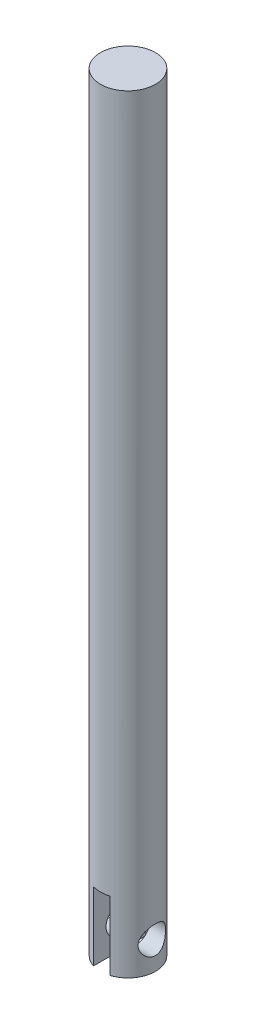
ISO-10303-21;
HEADER;
FILE_DESCRIPTION(('STEP AP214'),'2;1');
FILE_NAME('part.step','',(''),(''),'','','');
FILE_SCHEMA(('AUTOMOTIVE_DESIGN { 1 0 10303 214 1 1 1 1 }'));
ENDSEC;
DATA;
#1=APPLICATION_CONTEXT('core data for automotive mechanical design processes');
#2=APPLICATION_PROTOCOL_DEFINITION('international standard','automotive_design',2000,#1);
#3=PRODUCT_CONTEXT('',#1,'mechanical');
#4=PRODUCT('Part','Part','',(#3));
#5=PRODUCT_RELATED_PRODUCT_CATEGORY('part','',(#4));
#6=PRODUCT_DEFINITION_FORMATION('','',#4);
#7=PRODUCT_DEFINITION_CONTEXT('part definition',#1,'design');
#8=PRODUCT_DEFINITION('design','',#6,#7);
#9=PRODUCT_DEFINITION_SHAPE('','',#8);
#10=(LENGTH_UNIT() NAMED_UNIT(*) SI_UNIT(.MILLI.,.METRE.));
#11=(NAMED_UNIT(*) PLANE_ANGLE_UNIT() SI_UNIT($,.RADIAN.));
#12=(NAMED_UNIT(*) SI_UNIT($,.STERADIAN.) SOLID_ANGLE_UNIT());
#13=UNCERTAINTY_MEASURE_WITH_UNIT(LENGTH_MEASURE(1.E-05),#10,'distance_accuracy_value','');
#14=(GEOMETRIC_REPRESENTATION_CONTEXT(3) GLOBAL_UNCERTAINTY_ASSIGNED_CONTEXT((#13)) GLOBAL_UNIT_ASSIGNED_CONTEXT((#10,
#11,#12)) REPRESENTATION_CONTEXT('',''));
#15=CARTESIAN_POINT('',(0.,0.,0.));
#16=DIRECTION('',(0.,0.,1.));
#17=DIRECTION('',(1.,0.,0.));
#18=AXIS2_PLACEMENT_3D('',#15,#16,#17);
#19=CARTESIAN_POINT('',(0.,0.,0.));
#20=DIRECTION('',(0.,1.,0.));
#21=DIRECTION('',(0.,0.,1.));
#22=AXIS2_PLACEMENT_3D('',#19,#20,#21);
#23=PLANE('',#22);
#24=CARTESIAN_POINT('',(0.,0.,0.));
#25=DIRECTION('',(0.,1.,0.));
#26=DIRECTION('',(0.,0.,1.));
#27=AXIS2_PLACEMENT_3D('',#24,#25,#26);
#28=CIRCLE('',#27,2.);
#29=CARTESIAN_POINT('',(-0.6,0.,-1.90787840283389));
#30=VERTEX_POINT('',#29);
#31=CARTESIAN_POINT('',(-0.6,0.,1.90787840283389));
#32=VERTEX_POINT('',#31);
#33=EDGE_CURVE('E115',#30,#32,#28,.T.);
#34=ORIENTED_EDGE('',*,*,#33,.F.);
#35=DIRECTION('',(0.,0.,1.));
#36=VECTOR('',#35,1.);
#37=CARTESIAN_POINT('',(-0.6,0.,0.));
#38=LINE('',#37,#36);
#39=EDGE_CURVE('E125',#30,#32,#38,.T.);
#40=ORIENTED_EDGE('',*,*,#39,.T.);
#41=EDGE_LOOP('',(#34,#40));
#42=FACE_BOUND('',#41,.T.);
#43=ADVANCED_FACE('F40',(#42),#23,.F.);
#44=CARTESIAN_POINT('',(0.,55.9,0.));
#45=DIRECTION('',(0.,-1.,0.));
#46=DIRECTION('',(0.,0.,-1.));
#47=AXIS2_PLACEMENT_3D('',#44,#45,#46);
#48=CYLINDRICAL_SURFACE('',#47,2.);
#49=CARTESIAN_POINT('',(-2.,1.,0.));
#50=CARTESIAN_POINT('',(-1.99999713404151,1.0000033023195,-0.0525719629529865));
#51=CARTESIAN_POINT('',(-1.99790491019518,1.00417007312167,-0.105206599698033));
#52=CARTESIAN_POINT('',(-1.98974156037396,1.02065288034092,-0.208920235268425));
#53=CARTESIAN_POINT('',(-1.98366287828984,1.03298439299765,-0.259996086713504));
#54=CARTESIAN_POINT('',(-1.96816279403312,1.06519380861679,-0.358933544880574));
#55=CARTESIAN_POINT('',(-1.9587543917752,1.08504238424801,-0.40680680293918));
#56=CARTESIAN_POINT('',(-1.93745776515779,1.13157062136494,-0.498472616806565));
#57=CARTESIAN_POINT('',(-1.9255697363353,1.15824974424885,-0.54226549399005));
#58=CARTESIAN_POINT('',(-1.89956258258057,1.2195172494853,-0.627507817761919));
#59=CARTESIAN_POINT('',(-1.88535199127536,1.25448647923964,-0.668655211122112));
#60=CARTESIAN_POINT('',(-1.85659970246744,1.33052147924703,-0.744779444866977));
#61=CARTESIAN_POINT('',(-1.84205776209035,1.37159185177244,-0.779751583106767));
#62=CARTESIAN_POINT('',(-1.81298951197347,1.46248334952338,-0.845252000450279));
#63=CARTESIAN_POINT('',(-1.79855186970132,1.51273609834591,-0.875225335551637));
#64=CARTESIAN_POINT('',(-1.77285978772321,1.61836733598621,-0.926168226890695));
#65=CARTESIAN_POINT('',(-1.7616030760699,1.67374212872275,-0.947144214966334));
#66=CARTESIAN_POINT('',(-1.74457867037809,1.78466510542192,-0.978132442188588));
#67=CARTESIAN_POINT('',(-1.73852271583714,1.84000445206739,-0.988725857080441));
#68=CARTESIAN_POINT('',(-1.73181889948528,1.95197883777948,-1.00042699330885));
#69=CARTESIAN_POINT('',(-1.73116569343288,2.00861254087116,-1.00154408837307));
#70=CARTESIAN_POINT('',(-1.73510930257248,2.11428602431537,-0.994687287172294));
#71=CARTESIAN_POINT('',(-1.73908763662014,2.16342403122305,-0.987784559536821));
#72=CARTESIAN_POINT('',(-1.7507622873385,2.25972190937304,-0.966939849056932));
#73=CARTESIAN_POINT('',(-1.75845978831776,2.30688114530532,-0.952995623897652));
#74=CARTESIAN_POINT('',(-1.77687476412741,2.39922913256566,-0.918209780386004));
#75=CARTESIAN_POINT('',(-1.78765840663999,2.44434639878579,-0.897215067115995));
#76=CARTESIAN_POINT('',(-1.81103404281404,2.53063429259001,-0.849041687668002));
#77=CARTESIAN_POINT('',(-1.82362684780191,2.57180313560009,-0.821860243812467));
#78=CARTESIAN_POINT('',(-1.85113157903286,2.65452125274323,-0.758066054912788));
#79=CARTESIAN_POINT('',(-1.86613510236746,2.69545687357616,-0.720694458369282));
#80=CARTESIAN_POINT('',(-1.89547623300407,2.7707354185909,-0.639555578741373));
#81=CARTESIAN_POINT('',(-1.90981351958801,2.80507519203388,-0.595785256574285));
#82=CARTESIAN_POINT('',(-1.93701987282964,2.86768566102973,-0.500516505831848));
#83=CARTESIAN_POINT('',(-1.94978984162007,2.89560047244574,-0.448753591599409));
#84=CARTESIAN_POINT('',(-1.97157881121242,2.94209702904301,-0.340466215488797));
#85=CARTESIAN_POINT('',(-1.98060078943553,2.96068618501517,-0.283945576265277));
#86=CARTESIAN_POINT('',(-1.99324333741436,2.98647540371668,-0.172766491660702));
#87=CARTESIAN_POINT('',(-1.99724938301312,2.99449123574678,-0.118341530548324));
#88=CARTESIAN_POINT('',(-2.00073013459102,3.00146473113449,-0.00877959994935366));
#89=CARTESIAN_POINT('',(-2.00020698721312,3.00042668563948,0.0463570198699013));
#90=CARTESIAN_POINT('',(-1.99491192253441,2.98979331158125,0.151232971985993));
#91=CARTESIAN_POINT('',(-1.9904724568819,2.98086746726997,0.201059408049954));
#92=CARTESIAN_POINT('',(-1.97822171314819,2.95576192810492,0.298406892301917));
#93=CARTESIAN_POINT('',(-1.97041006334332,2.93958143354664,0.345927685690997));
#94=CARTESIAN_POINT('',(-1.95184251413669,2.90000153356683,0.438888608449665));
#95=CARTESIAN_POINT('',(-1.94100881769939,2.87640894988319,0.484230397006153));
#96=CARTESIAN_POINT('',(-1.91743974317109,2.82289246435396,0.570461361698921));
#97=CARTESIAN_POINT('',(-1.90470355565785,2.79296586540657,0.611348629775282));
#98=CARTESIAN_POINT('',(-1.87708221337464,2.72423957466713,0.691767689290653));
#99=CARTESIAN_POINT('',(-1.86210884848441,2.68485713154643,0.730772077824639));
#100=CARTESIAN_POINT('',(-1.83262391603874,2.6000748487307,0.80185632111324));
#101=CARTESIAN_POINT('',(-1.81811267381526,2.55467088118363,0.833931385690841));
#102=CARTESIAN_POINT('',(-1.79051192226068,2.45635634579969,0.891707914497696));
#103=CARTESIAN_POINT('',(-1.77752529663472,2.40318873379141,0.917025495878637));
#104=CARTESIAN_POINT('',(-1.75574072368126,2.29248993230748,0.958082826013803));
#105=CARTESIAN_POINT('',(-1.74693738240618,2.23496447349881,0.97383491588757));
#106=CARTESIAN_POINT('',(-1.73561501008667,2.12308977713855,0.993861687449679));
#107=CARTESIAN_POINT('',(-1.73257383460491,2.06896574657096,0.999092996400865));
#108=CARTESIAN_POINT('',(-1.73165354646175,1.96055293282927,1.00068915438079));
#109=CARTESIAN_POINT('',(-1.73377219627553,1.90626423126057,0.997057846624399));
#110=CARTESIAN_POINT('',(-1.74237862050025,1.80451649846799,0.981926125592263));
#111=CARTESIAN_POINT('',(-1.74843094482394,1.7568995298556,0.9712083143428));
#112=CARTESIAN_POINT('',(-1.76371016187918,1.66419188057529,0.943175358224645));
#113=CARTESIAN_POINT('',(-1.77293807569676,1.61910201790803,0.92585809115981));
#114=CARTESIAN_POINT('',(-1.79428530364528,1.52937514901339,0.883815745300683));
#115=CARTESIAN_POINT('',(-1.80655722396191,1.4849720981703,0.858671137816458));
#116=CARTESIAN_POINT('',(-1.8323533163459,1.40072546381941,0.802150971636635));
#117=CARTESIAN_POINT('',(-1.84587813794522,1.36088426948151,0.770772171238649));
#118=CARTESIAN_POINT('',(-1.87462323159313,1.28185801764238,0.698203326664642));
#119=CARTESIAN_POINT('',(-1.88984983311469,1.24334089763808,0.656284423010172));
#120=CARTESIAN_POINT('',(-1.91877752255088,1.17373701657637,0.56615480622028));
#121=CARTESIAN_POINT('',(-1.9324777860804,1.14265426057371,0.517940723256785));
#122=CARTESIAN_POINT('',(-1.95698009585103,1.0887636372378,0.415931596819947));
#123=CARTESIAN_POINT('',(-1.96776096562909,1.06601583058857,0.362099503934614));
#124=CARTESIAN_POINT('',(-1.98501341363465,1.03019183208105,0.250742101294191));
#125=CARTESIAN_POINT('',(-1.99149723372932,1.01708815317042,0.193227799623166));
#126=CARTESIAN_POINT('',(-1.99695461909663,1.00610258892415,0.112601946483384));
#127=CARTESIAN_POINT('',(-1.99809365339202,1.00381735913638,0.0901618794394989));
#128=CARTESIAN_POINT('',(-1.99961696977865,1.00076533448319,0.0451517318071578));
#129=CARTESIAN_POINT('',(-2.00000123103763,0.9999985815288,0.0225816476473815));
#130=CARTESIAN_POINT('',(-2.,1.,0.));
#131=B_SPLINE_CURVE_WITH_KNOTS('',3,(#49,#50,#51,#52,#53,#54,#55,#56,#57,#58,#59,#60,#61,#62,
#63,#64,#65,#66,#67,#68,#69,#70,#71,#72,#73,#74,#75,#76,#77,#78,#79,#80,#81,#82,#83,#84,#85,#86,
#87,#88,#89,#90,#91,#92,#93,#94,#95,#96,#97,#98,#99,#100,#101,#102,#103,#104,#105,#106,#107,
#108,#109,#110,#111,#112,#113,#114,#115,#116,#117,#118,#119,#120,#121,#122,#123,#124,#125,#126,
#127,#128,#129,#130),.UNSPECIFIED.,.T.,.F.,(4,2,2,2,2,2,2,2,2,2,2,2,2,2,2,2,2,2,2,2,2,2,2,2,2,2,
2,2,2,2,2,2,2,2,2,2,2,2,2,2,4),(0.,0.157624257420292,0.315548149709198,0.472862155492298,
0.630163760581568,0.796981758718089,0.963926237654036,1.14381726430753,1.32357947898281,
1.4925801214023,1.6614135732902,1.81005712409321,1.95874803925678,2.11090240168487,
2.26312521260222,2.43464941333878,2.60625534598686,2.78583022214441,2.9652621691228,
3.12983290471346,3.29432564511476,3.44606906506122,3.59782921630931,3.75392856027899,
3.91009450748339,4.08159610644419,4.25321588615432,4.43314682159674,4.61284511940778,
4.77529307498373,4.93767059860005,5.08457930244183,5.23153528783678,5.38836456775614,
5.54527561138958,5.72125242752499,5.89732383376573,6.07464013662925,6.2514490862493,
6.31915280137698,6.38685838514847),.UNSPECIFIED.);
#132=CARTESIAN_POINT('',(-2.,1.,0.));
#133=VERTEX_POINT('',#132);
#134=EDGE_CURVE('E96',#133,#133,#131,.T.);
#135=ORIENTED_EDGE('',*,*,#134,.T.);
#136=EDGE_LOOP('',(#135));
#137=FACE_BOUND('',#136,.T.);
#138=CARTESIAN_POINT('',(1.73205080756888,2.,-1.));
#139=CARTESIAN_POINT('',(1.73205534728459,1.94789219180475,-0.999996363074532));
#140=CARTESIAN_POINT('',(1.73443801187756,1.89571858847495,-0.995899970733216));
#141=CARTESIAN_POINT('',(1.74362366452052,1.79297273532285,-0.979723209898053));
#142=CARTESIAN_POINT('',(1.75043594055559,1.74240408495659,-0.967626064554179));
#143=CARTESIAN_POINT('',(1.76749346605398,1.64454833565606,-0.936099948699812));
#144=CARTESIAN_POINT('',(1.77772043473252,1.59724534752641,-0.916709952493731));
#145=CARTESIAN_POINT('',(1.80042664816858,1.50657579800328,-0.871267525376372));
#146=CARTESIAN_POINT('',(1.81290601476065,1.46320944973754,-0.845214734035773));
#147=CARTESIAN_POINT('',(1.83996869057441,1.37769427144249,-0.784666540530879));
#148=CARTESIAN_POINT('',(1.85464063637954,1.33594086432646,-0.74965203614377));
#149=CARTESIAN_POINT('',(1.88371982785706,1.25859161159329,-0.673253807614468));
#150=CARTESIAN_POINT('',(1.8981269383125,1.22299883741648,-0.631866925782293));
#151=CARTESIAN_POINT('',(1.92621476952949,1.15663284885234,-0.540489563414546));
#152=CARTESIAN_POINT('',(1.93978106418172,1.12634623214047,-0.490107189012575));
#153=CARTESIAN_POINT('',(1.96350756099529,1.07485914675424,-0.384157026599504));
#154=CARTESIAN_POINT('',(1.97366991183742,1.05365294386283,-0.328592538138155));
#155=CARTESIAN_POINT('',(1.98880461244237,1.0224953386989,-0.218044943925977));
#156=CARTESIAN_POINT('',(1.99409480220892,1.01185047364447,-0.163301790488817));
#157=CARTESIAN_POINT('',(2.00007583846067,0.999833881324962,-0.052570628697848));
#158=CARTESIAN_POINT('',(2.0007694678459,0.99845654320429,0.00341660584373865));
#159=CARTESIAN_POINT('',(1.9976298191645,1.00474667397035,0.10983252442375));
#160=CARTESIAN_POINT('',(1.9941849589216,1.01163801552122,0.160321199176792));
#161=CARTESIAN_POINT('',(1.98374245259747,1.03288084390466,0.259313771918322));
#162=CARTESIAN_POINT('',(1.97674454066394,1.04723288897622,0.307817521093926));
#163=CARTESIAN_POINT('',(1.95971583287654,1.08308256608981,0.402309391569554));
#164=CARTESIAN_POINT('',(1.94964441529199,1.10467631317207,0.448253423515178));
#165=CARTESIAN_POINT('',(1.92737645986687,1.15426341620149,0.535976801513328));
#166=CARTESIAN_POINT('',(1.91517916157484,1.18225906330235,0.577754648838646));
#167=CARTESIAN_POINT('',(1.88844394399229,1.24689535153302,0.660173660898195));
#168=CARTESIAN_POINT('',(1.87379375998175,1.28410302832601,0.700334075029361));
#169=CARTESIAN_POINT('',(1.84454340586812,1.36458972493018,0.77410437029778));
#170=CARTESIAN_POINT('',(1.82994328265629,1.40787337227406,0.807709211574231));
#171=CARTESIAN_POINT('',(1.80144156092485,1.50264819242409,0.869505334642211));
#172=CARTESIAN_POINT('',(1.78764319990708,1.55448602305421,0.897217314978051));
#173=CARTESIAN_POINT('',(1.76375450278576,1.662937671359,0.943319113001231));
#174=CARTESIAN_POINT('',(1.75366030046067,1.71954643301756,0.96171865821089));
#175=CARTESIAN_POINT('',(1.73944635817034,1.83121451128279,0.98718021102504));
#176=CARTESIAN_POINT('',(1.73491655848496,1.88604111904355,0.995025122119976));
#177=CARTESIAN_POINT('',(1.7311791936161,1.99640134151654,1.00151694661143));
#178=CARTESIAN_POINT('',(1.73196786889312,2.05193442911979,1.00017035731503));
#179=CARTESIAN_POINT('',(1.73834336540585,2.15565391857873,0.989036043343966));
#180=CARTESIAN_POINT('',(1.74339587506654,2.20397945110793,0.980187816712467));
#181=CARTESIAN_POINT('',(1.75694021551341,2.29836778627096,0.955696284632441));
#182=CARTESIAN_POINT('',(1.76543316005034,2.34442985074661,0.940050778623614));
#183=CARTESIAN_POINT('',(1.78536222079657,2.4354113309027,0.901647588604886));
#184=CARTESIAN_POINT('',(1.79691643243063,2.48017901685355,0.878594063692723));
#185=CARTESIAN_POINT('',(1.8215611949725,2.56546927153899,0.826287064015804));
#186=CARTESIAN_POINT('',(1.83465253355148,2.60598964351328,0.797030404332216));
#187=CARTESIAN_POINT('',(1.86287998456336,2.68697876752355,0.728837167198853));
#188=CARTESIAN_POINT('',(1.87806583154289,2.72679715071766,0.689145272314966));
#189=CARTESIAN_POINT('',(1.90734234977892,2.79941223799359,0.603404495398288));
#190=CARTESIAN_POINT('',(1.92143265007709,2.83220657023054,0.557353474655347));
#191=CARTESIAN_POINT('',(1.94741361690957,2.8905737259501,0.458535362558757));
#192=CARTESIAN_POINT('',(1.95923641672029,2.91593311821091,0.405623097574113));
#193=CARTESIAN_POINT('',(1.97883354959301,2.95713790385739,0.295522364641082));
#194=CARTESIAN_POINT('',(1.98661143676373,2.9729916513663,0.238337701392176));
#195=CARTESIAN_POINT('',(1.99667508181883,2.99336856417466,0.126979682330417));
#196=CARTESIAN_POINT('',(1.99939927908191,2.99879787587611,0.0730114438504569));
#197=CARTESIAN_POINT('',(2.00042130375131,3.0008432654544,-0.0351259859512036));
#198=CARTESIAN_POINT('',(1.9987206806689,2.99746242852356,-0.0892951002950869));
#199=CARTESIAN_POINT('',(1.99133968837923,2.98258359320438,-0.192537992317147));
#200=CARTESIAN_POINT('',(1.9859289466799,2.97163515074233,-0.241712317811264));
#201=CARTESIAN_POINT('',(1.97192093663423,2.94267300069703,-0.337445952183618));
#202=CARTESIAN_POINT('',(1.96332321132796,2.92465827990655,-0.384004884955509));
#203=CARTESIAN_POINT('',(1.9432593074812,2.88127294783403,-0.475423406244885));
#204=CARTESIAN_POINT('',(1.93168617198799,2.85562067679216,-0.520125142700046));
#205=CARTESIAN_POINT('',(1.90688133141826,2.79804206914095,-0.604774641814025));
#206=CARTESIAN_POINT('',(1.89364886558361,2.76611285088433,-0.644720207414907));
#207=CARTESIAN_POINT('',(1.86528610226628,2.6932028609773,-0.722914004156891));
#208=CARTESIAN_POINT('',(1.85009799011698,2.65163751252281,-0.760597684539272));
#209=CARTESIAN_POINT('',(1.82063076162852,2.56254927887023,-0.828663287394675));
#210=CARTESIAN_POINT('',(1.80635245761865,2.51502117913232,-0.859038750010058));
#211=CARTESIAN_POINT('',(1.77999605304916,2.41336335341905,-0.912431079785654));
#212=CARTESIAN_POINT('',(1.7680017425627,2.35907246887126,-0.935185065960939));
#213=CARTESIAN_POINT('',(1.74866156328352,2.24666759566022,-0.970878709506412));
#214=CARTESIAN_POINT('',(1.74130016147702,2.18856711108731,-0.983851191175347));
#215=CARTESIAN_POINT('',(1.7352927260179,2.108194644348,-0.994367007864415));
#216=CARTESIAN_POINT('',(1.73408129005152,2.08663210560212,-0.996476104963851));
#217=CARTESIAN_POINT('',(1.7324593588775,2.04338351931776,-0.999293405089963));
#218=CARTESIAN_POINT('',(1.73204891725109,2.02169746361413,-1.00000151439987));
#219=CARTESIAN_POINT('',(1.73205080756888,2.,-1.));
#220=B_SPLINE_CURVE_WITH_KNOTS('',3,(#138,#139,#140,#141,#142,#143,#144,#145,#146,#147,#148,
#149,#150,#151,#152,#153,#154,#155,#156,#157,#158,#159,#160,#161,#162,#163,#164,#165,#166,#167,
#168,#169,#170,#171,#172,#173,#174,#175,#176,#177,#178,#179,#180,#181,#182,#183,#184,#185,#186,
#187,#188,#189,#190,#191,#192,#193,#194,#195,#196,#197,#198,#199,#200,#201,#202,#203,#204,#205,
#206,#207,#208,#209,#210,#211,#212,#213,#214,#215,#216,#217,#218,#219),.UNSPECIFIED.,.T.,.F.,(4,
2,2,2,2,2,2,2,2,2,2,2,2,2,2,2,2,2,2,2,2,2,2,2,2,2,2,2,2,2,2,2,2,2,2,2,2,2,2,2,4),(0.,
0.156232122594716,0.312792892824805,0.468528595918886,0.62427272544515,0.792862312498234,
0.96153571084371,1.14157892238763,1.32150826963891,1.48863484967935,1.6556602368604,
1.80816097484538,1.96067312517455,2.11529534731147,2.26997299350272,2.43927191456891,
2.60870048245919,2.78888841729448,2.96888774211705,3.13462290854212,3.30024093188373,
3.44774183424026,3.59529052436063,3.74967296406088,3.90413486220047,4.07806743580613,
4.25205864978202,4.43064181412966,4.60906779808772,4.77112270389487,4.93312086793972,
5.08444424871493,5.23578933512013,5.39360750719472,5.55149830100719,5.72510241850067,
5.89885942845154,6.07810749038605,6.2567513300276,6.32180135185309,6.38685572494541),.UNSPECIFIED.);
#221=CARTESIAN_POINT('',(1.73205080756888,2.,-1.));
#222=VERTEX_POINT('',#221);
#223=EDGE_CURVE('E152',#222,#222,#220,.T.);
#224=ORIENTED_EDGE('',*,*,#223,.T.);
#225=EDGE_LOOP('',(#224));
#226=FACE_BOUND('',#225,.T.);
#227=CARTESIAN_POINT('',(0.,55.9,0.));
#228=DIRECTION('',(0.,1.,0.));
#229=DIRECTION('',(0.,0.,1.));
#230=AXIS2_PLACEMENT_3D('',#227,#228,#229);
#231=CIRCLE('',#230,2.);
#232=CARTESIAN_POINT('',(0.,55.9,2.));
#233=VERTEX_POINT('',#232);
#234=EDGE_CURVE('E116',#233,#233,#231,.T.);
#235=ORIENTED_EDGE('',*,*,#234,.F.);
#236=EDGE_LOOP('',(#235));
#237=FACE_BOUND('',#236,.T.);
#238=CARTESIAN_POINT('',(0.,5.,0.));
#239=DIRECTION('',(0.,1.,0.));
#240=DIRECTION('',(0.,0.,1.));
#241=AXIS2_PLACEMENT_3D('',#238,#239,#240);
#242=CIRCLE('',#241,2.);
#243=CARTESIAN_POINT('',(-0.600000000000001,5.,1.90787840283389));
#244=VERTEX_POINT('',#243);
#245=CARTESIAN_POINT('',(0.599999999999999,5.,1.90787840283389));
#246=VERTEX_POINT('',#245);
#247=EDGE_CURVE('E51',#244,#246,#242,.T.);
#248=ORIENTED_EDGE('',*,*,#247,.T.);
#249=DIRECTION('',(0.,-1.,0.));
#250=VECTOR('',#249,1.);
#251=CARTESIAN_POINT('',(0.599999999999993,55.9,1.90787840283389));
#252=LINE('',#251,#250);
#253=CARTESIAN_POINT('',(0.6,0.,1.90787840283389));
#254=VERTEX_POINT('',#253);
#255=EDGE_CURVE('E94',#246,#254,#252,.T.);
#256=ORIENTED_EDGE('',*,*,#255,.T.);
#257=CARTESIAN_POINT('',(0.6,0.,-1.90787840283389));
#258=VERTEX_POINT('',#257);
#259=EDGE_CURVE('E100',#254,#258,#28,.T.);
#260=ORIENTED_EDGE('',*,*,#259,.T.);
#261=DIRECTION('',(0.,-1.,0.));
#262=VECTOR('',#261,1.);
#263=CARTESIAN_POINT('',(0.599999999999993,55.9,-1.90787840283389));
#264=LINE('',#263,#262);
#265=CARTESIAN_POINT('',(0.599999999999999,5.,-1.90787840283389));
#266=VERTEX_POINT('',#265);
#267=EDGE_CURVE('E58',#258,#266,#264,.F.);
#268=ORIENTED_EDGE('',*,*,#267,.T.);
#269=CARTESIAN_POINT('',(-0.600000000000001,5.,-1.90787840283389));
#270=VERTEX_POINT('',#269);
#271=EDGE_CURVE('E11',#266,#270,#242,.T.);
#272=ORIENTED_EDGE('',*,*,#271,.T.);
#273=DIRECTION('',(0.,-1.,0.));
#274=VECTOR('',#273,1.);
#275=CARTESIAN_POINT('',(-0.600000000000007,55.9,-1.90787840283389));
#276=LINE('',#275,#274);
#277=EDGE_CURVE('E112',#270,#30,#276,.T.);
#278=ORIENTED_EDGE('',*,*,#277,.T.);
#279=ORIENTED_EDGE('',*,*,#33,.T.);
#280=DIRECTION('',(0.,-1.,0.));
#281=VECTOR('',#280,1.);
#282=CARTESIAN_POINT('',(-0.600000000000007,55.9,1.90787840283389));
#283=LINE('',#282,#281);
#284=EDGE_CURVE('E66',#32,#244,#283,.F.);
#285=ORIENTED_EDGE('',*,*,#284,.T.);
#286=EDGE_LOOP('',(#248,#256,#260,#268,#272,#278,#279,#285));
#287=FACE_BOUND('',#286,.T.);
#288=ADVANCED_FACE('F42',(#137,#226,#237,#287),#48,.T.);
#289=CARTESIAN_POINT('',(0.,55.9,0.));
#290=DIRECTION('',(0.,1.,0.));
#291=DIRECTION('',(0.,0.,1.));
#292=AXIS2_PLACEMENT_3D('',#289,#290,#291);
#293=PLANE('',#292);
#294=ORIENTED_EDGE('',*,*,#234,.T.);
#295=EDGE_LOOP('',(#294));
#296=FACE_BOUND('',#295,.T.);
#297=ADVANCED_FACE('F136',(#296),#293,.T.);
#298=ORIENTED_EDGE('',*,*,#259,.F.);
#299=DIRECTION('',(0.,0.,-1.));
#300=VECTOR('',#299,1.);
#301=CARTESIAN_POINT('',(0.6,0.,0.));
#302=LINE('',#301,#300);
#303=EDGE_CURVE('E120',#254,#258,#302,.T.);
#304=ORIENTED_EDGE('',*,*,#303,.T.);
#305=EDGE_LOOP('',(#298,#304));
#306=FACE_BOUND('',#305,.T.);
#307=ADVANCED_FACE('F132',(#306),#23,.F.);
#308=CARTESIAN_POINT('',(0.599999999999999,5.,-2.));
#309=DIRECTION('',(0.,1.,0.));
#310=DIRECTION('',(0.,0.,1.));
#311=AXIS2_PLACEMENT_3D('',#308,#309,#310);
#312=PLANE('',#311);
#313=DIRECTION('',(0.,0.,1.));
#314=VECTOR('',#313,1.);
#315=CARTESIAN_POINT('',(0.599999999999999,5.,-2.));
#316=LINE('',#315,#314);
#317=EDGE_CURVE('E87',#266,#246,#316,.T.);
#318=ORIENTED_EDGE('',*,*,#317,.T.);
#319=ORIENTED_EDGE('',*,*,#247,.F.);
#320=DIRECTION('',(0.,0.,1.));
#321=VECTOR('',#320,1.);
#322=CARTESIAN_POINT('',(-0.600000000000001,5.,-2.));
#323=LINE('',#322,#321);
#324=EDGE_CURVE('E88',#270,#244,#323,.T.);
#325=ORIENTED_EDGE('',*,*,#324,.F.);
#326=ORIENTED_EDGE('',*,*,#271,.F.);
#327=EDGE_LOOP('',(#318,#319,#325,#326));
#328=FACE_BOUND('',#327,.T.);
#329=ADVANCED_FACE('F86',(#328),#312,.F.);
#330=CARTESIAN_POINT('',(-0.600000000000001,5.,-2.));
#331=DIRECTION('',(-1.,0.,0.));
#332=DIRECTION('',(0.,-1.,0.));
#333=AXIS2_PLACEMENT_3D('',#330,#331,#332);
#334=PLANE('',#333);
#335=CARTESIAN_POINT('',(-0.6,2.,0.));
#336=DIRECTION('',(-1.,0.,0.));
#337=DIRECTION('',(0.,-1.,0.));
#338=AXIS2_PLACEMENT_3D('',#335,#336,#337);
#339=CIRCLE('',#338,1.);
#340=CARTESIAN_POINT('',(-0.6,1.,0.));
#341=VERTEX_POINT('',#340);
#342=EDGE_CURVE('E150',#341,#341,#339,.T.);
#343=ORIENTED_EDGE('',*,*,#342,.T.);
#344=EDGE_LOOP('',(#343));
#345=FACE_BOUND('',#344,.T.);
#346=ORIENTED_EDGE('',*,*,#324,.T.);
#347=ORIENTED_EDGE('',*,*,#284,.F.);
#348=ORIENTED_EDGE('',*,*,#39,.F.);
#349=ORIENTED_EDGE('',*,*,#277,.F.);
#350=EDGE_LOOP('',(#346,#347,#348,#349));
#351=FACE_BOUND('',#350,.T.);
#352=ADVANCED_FACE('F128',(#345,#351),#334,.F.);
#353=CARTESIAN_POINT('',(0.599999999999999,5.,-2.));
#354=DIRECTION('',(1.,0.,0.));
#355=DIRECTION('',(0.,1.,0.));
#356=AXIS2_PLACEMENT_3D('',#353,#354,#355);
#357=PLANE('',#356);
#358=CARTESIAN_POINT('',(0.6,2.,0.));
#359=DIRECTION('',(1.,0.,0.));
#360=DIRECTION('',(0.,1.,0.));
#361=AXIS2_PLACEMENT_3D('',#358,#359,#360);
#362=CIRCLE('',#361,1.);
#363=CARTESIAN_POINT('',(0.6,3.,0.));
#364=VERTEX_POINT('',#363);
#365=EDGE_CURVE('E45',#364,#364,#362,.T.);
#366=ORIENTED_EDGE('',*,*,#365,.T.);
#367=EDGE_LOOP('',(#366));
#368=FACE_BOUND('',#367,.T.);
#369=ORIENTED_EDGE('',*,*,#317,.F.);
#370=ORIENTED_EDGE('',*,*,#267,.F.);
#371=ORIENTED_EDGE('',*,*,#303,.F.);
#372=ORIENTED_EDGE('',*,*,#255,.F.);
#373=EDGE_LOOP('',(#369,#370,#371,#372));
#374=FACE_BOUND('',#373,.T.);
#375=ADVANCED_FACE('F92',(#368,#374),#357,.F.);
#376=CARTESIAN_POINT('',(-2.,2.,0.));
#377=DIRECTION('',(1.,0.,0.));
#378=DIRECTION('',(0.,0.,-1.));
#379=AXIS2_PLACEMENT_3D('',#376,#377,#378);
#380=CYLINDRICAL_SURFACE('',#379,1.);
#381=ORIENTED_EDGE('',*,*,#365,.F.);
#382=EDGE_LOOP('',(#381));
#383=FACE_BOUND('',#382,.T.);
#384=ORIENTED_EDGE('',*,*,#223,.F.);
#385=EDGE_LOOP('',(#384));
#386=FACE_BOUND('',#385,.T.);
#387=ADVANCED_FACE('F171',(#383,#386),#380,.F.);
#388=ORIENTED_EDGE('',*,*,#342,.F.);
#389=EDGE_LOOP('',(#388));
#390=FACE_BOUND('',#389,.T.);
#391=ORIENTED_EDGE('',*,*,#134,.F.);
#392=EDGE_LOOP('',(#391));
#393=FACE_BOUND('',#392,.T.);
#394=ADVANCED_FACE('F168',(#390,#393),#380,.F.);
#395=CLOSED_SHELL('',(#43,#288,#297,#307,#329,#352,#375,#387,#394));
#396=MANIFOLD_SOLID_BREP('B2',#395);
#397=ADVANCED_BREP_SHAPE_REPRESENTATION('',(#18,#396),#14);
#398=SHAPE_DEFINITION_REPRESENTATION(#9,#397);
ENDSEC;
END-ISO-10303-21;
